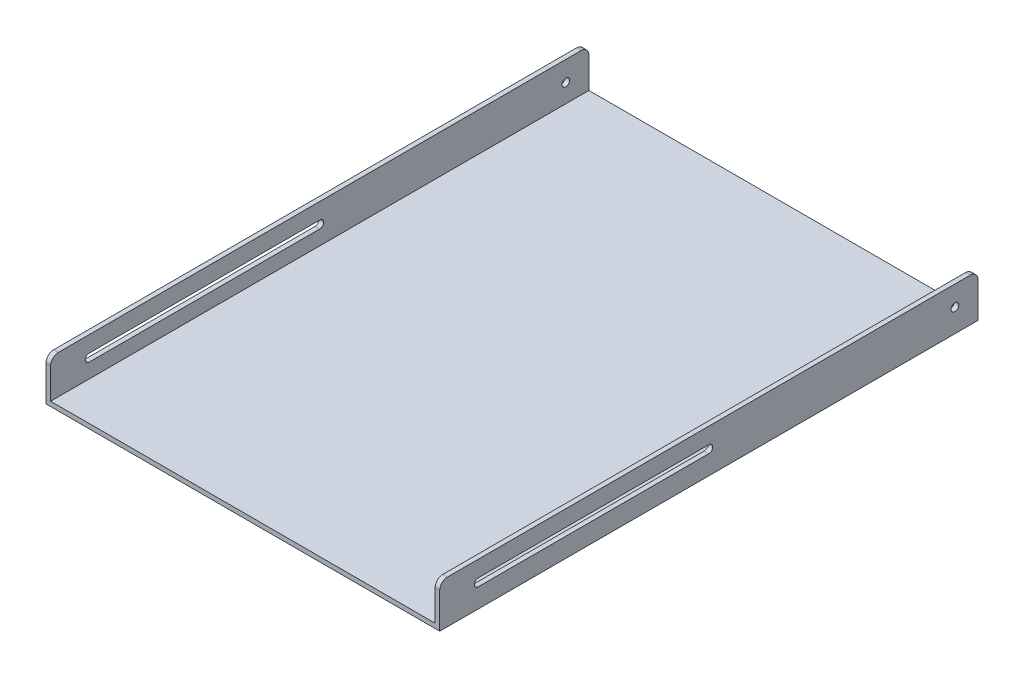
ISO-10303-21;
HEADER;
FILE_DESCRIPTION(('STEP AP214'),'2;1');
FILE_NAME('part.step','',(''),(''),'','','');
FILE_SCHEMA(('AUTOMOTIVE_DESIGN { 1 0 10303 214 1 1 1 1 }'));
ENDSEC;
DATA;
#1=APPLICATION_CONTEXT('core data for automotive mechanical design processes');
#2=APPLICATION_PROTOCOL_DEFINITION('international standard','automotive_design',2000,#1);
#3=PRODUCT_CONTEXT('',#1,'mechanical');
#4=PRODUCT('Part','Part','',(#3));
#5=PRODUCT_RELATED_PRODUCT_CATEGORY('part','',(#4));
#6=PRODUCT_DEFINITION_FORMATION('','',#4);
#7=PRODUCT_DEFINITION_CONTEXT('part definition',#1,'design');
#8=PRODUCT_DEFINITION('design','',#6,#7);
#9=PRODUCT_DEFINITION_SHAPE('','',#8);
#10=(LENGTH_UNIT() NAMED_UNIT(*) SI_UNIT(.MILLI.,.METRE.));
#11=(NAMED_UNIT(*) PLANE_ANGLE_UNIT() SI_UNIT($,.RADIAN.));
#12=(NAMED_UNIT(*) SI_UNIT($,.STERADIAN.) SOLID_ANGLE_UNIT());
#13=UNCERTAINTY_MEASURE_WITH_UNIT(LENGTH_MEASURE(1.E-05),#10,'distance_accuracy_value','');
#14=(GEOMETRIC_REPRESENTATION_CONTEXT(3) GLOBAL_UNCERTAINTY_ASSIGNED_CONTEXT((#13)) GLOBAL_UNIT_ASSIGNED_CONTEXT((#10,
#11,#12)) REPRESENTATION_CONTEXT('',''));
#15=CARTESIAN_POINT('',(0.,0.,0.));
#16=DIRECTION('',(0.,0.,1.));
#17=DIRECTION('',(1.,0.,0.));
#18=AXIS2_PLACEMENT_3D('',#15,#16,#17);
#19=CARTESIAN_POINT('',(256.,0.,350.));
#20=DIRECTION('',(-1.,0.,0.));
#21=DIRECTION('',(0.,0.,1.));
#22=AXIS2_PLACEMENT_3D('',#19,#20,#21);
#23=PLANE('',#22);
#24=DIRECTION('',(0.,0.,-1.));
#25=VECTOR('',#24,1.);
#26=CARTESIAN_POINT('',(256.,19.,300.));
#27=LINE('',#26,#25);
#28=CARTESIAN_POINT('',(256.,19.,300.));
#29=VERTEX_POINT('',#28);
#30=CARTESIAN_POINT('',(256.,19.,0.));
#31=VERTEX_POINT('',#30);
#32=EDGE_CURVE('E209',#29,#31,#27,.T.);
#33=ORIENTED_EDGE('',*,*,#32,.F.);
#34=CARTESIAN_POINT('',(256.,24.,300.));
#35=DIRECTION('',(1.,0.,0.));
#36=DIRECTION('',(0.,0.,-1.));
#37=AXIS2_PLACEMENT_3D('',#34,#35,#36);
#38=CIRCLE('',#37,5.);
#39=CARTESIAN_POINT('',(256.,29.,300.));
#40=VERTEX_POINT('',#39);
#41=EDGE_CURVE('E207',#40,#29,#38,.T.);
#42=ORIENTED_EDGE('',*,*,#41,.F.);
#43=DIRECTION('',(0.,0.,1.));
#44=VECTOR('',#43,1.);
#45=CARTESIAN_POINT('',(256.,29.,300.));
#46=LINE('',#45,#44);
#47=CARTESIAN_POINT('',(256.,29.0000000000001,0.));
#48=VERTEX_POINT('',#47);
#49=EDGE_CURVE('E199',#48,#40,#46,.T.);
#50=ORIENTED_EDGE('',*,*,#49,.F.);
#51=CARTESIAN_POINT('',(256.,24.,0.));
#52=DIRECTION('',(1.,0.,0.));
#53=DIRECTION('',(0.,0.,-1.));
#54=AXIS2_PLACEMENT_3D('',#51,#52,#53);
#55=CIRCLE('',#54,5.);
#56=EDGE_CURVE('E202',#31,#48,#55,.T.);
#57=ORIENTED_EDGE('',*,*,#56,.F.);
#58=EDGE_LOOP('',(#33,#42,#50,#57));
#59=FACE_BOUND('',#58,.T.);
#60=CARTESIAN_POINT('',(256.,24.,-320.));
#61=DIRECTION('',(1.,0.,0.));
#62=DIRECTION('',(0.,0.,-1.));
#63=AXIS2_PLACEMENT_3D('',#60,#61,#62);
#64=CIRCLE('',#63,4.99999999999999);
#65=CARTESIAN_POINT('',(256.,24.,-325.));
#66=VERTEX_POINT('',#65);
#67=EDGE_CURVE('E238',#66,#66,#64,.T.);
#68=ORIENTED_EDGE('',*,*,#67,.F.);
#69=EDGE_LOOP('',(#68));
#70=FACE_BOUND('',#69,.T.);
#71=DIRECTION('',(0.,0.,-1.));
#72=VECTOR('',#71,1.);
#73=CARTESIAN_POINT('',(256.,50.,350.));
#74=LINE('',#73,#72);
#75=CARTESIAN_POINT('',(256.,50.,340.));
#76=VERTEX_POINT('',#75);
#77=CARTESIAN_POINT('',(256.,50.,-340.));
#78=VERTEX_POINT('',#77);
#79=EDGE_CURVE('E299',#76,#78,#74,.T.);
#80=ORIENTED_EDGE('',*,*,#79,.F.);
#81=CARTESIAN_POINT('',(256.,40.,340.));
#82=DIRECTION('',(-1.,0.,0.));
#83=DIRECTION('',(0.,0.,1.));
#84=AXIS2_PLACEMENT_3D('',#81,#82,#83);
#85=CIRCLE('',#84,10.);
#86=CARTESIAN_POINT('',(256.,40.,350.));
#87=VERTEX_POINT('',#86);
#88=EDGE_CURVE('E309',#76,#87,#85,.F.);
#89=ORIENTED_EDGE('',*,*,#88,.T.);
#90=DIRECTION('',(0.,1.,0.));
#91=VECTOR('',#90,1.);
#92=CARTESIAN_POINT('',(256.,0.,350.));
#93=LINE('',#92,#91);
#94=CARTESIAN_POINT('',(256.,-6.,350.));
#95=VERTEX_POINT('',#94);
#96=EDGE_CURVE('E251',#95,#87,#93,.T.);
#97=ORIENTED_EDGE('',*,*,#96,.F.);
#98=DIRECTION('',(0.,0.,-1.));
#99=VECTOR('',#98,1.);
#100=CARTESIAN_POINT('',(256.,-6.,350.));
#101=LINE('',#100,#99);
#102=CARTESIAN_POINT('',(256.,-6.,-350.));
#103=VERTEX_POINT('',#102);
#104=EDGE_CURVE('E267',#95,#103,#101,.T.);
#105=ORIENTED_EDGE('',*,*,#104,.T.);
#106=DIRECTION('',(0.,1.,0.));
#107=VECTOR('',#106,1.);
#108=CARTESIAN_POINT('',(256.,0.,-350.));
#109=LINE('',#108,#107);
#110=CARTESIAN_POINT('',(256.,40.,-350.));
#111=VERTEX_POINT('',#110);
#112=EDGE_CURVE('E250',#103,#111,#109,.T.);
#113=ORIENTED_EDGE('',*,*,#112,.T.);
#114=CARTESIAN_POINT('',(256.,40.,-340.));
#115=DIRECTION('',(-1.,0.,0.));
#116=DIRECTION('',(0.,0.,1.));
#117=AXIS2_PLACEMENT_3D('',#114,#115,#116);
#118=CIRCLE('',#117,10.);
#119=EDGE_CURVE('E307',#111,#78,#118,.F.);
#120=ORIENTED_EDGE('',*,*,#119,.T.);
#121=EDGE_LOOP('',(#80,#89,#97,#105,#113,#120));
#122=FACE_BOUND('',#121,.T.);
#123=ADVANCED_FACE('F33',(#59,#70,#122),#23,.F.);
#124=CARTESIAN_POINT('',(250.,50.,350.));
#125=DIRECTION('',(0.,1.,0.));
#126=DIRECTION('',(0.,0.,1.));
#127=AXIS2_PLACEMENT_3D('',#124,#125,#126);
#128=PLANE('',#127);
#129=DIRECTION('',(0.,0.,-1.));
#130=VECTOR('',#129,1.);
#131=CARTESIAN_POINT('',(250.,50.,350.));
#132=LINE('',#131,#130);
#133=CARTESIAN_POINT('',(250.,50.,340.));
#134=VERTEX_POINT('',#133);
#135=CARTESIAN_POINT('',(250.,50.,-340.));
#136=VERTEX_POINT('',#135);
#137=EDGE_CURVE('E296',#134,#136,#132,.T.);
#138=ORIENTED_EDGE('',*,*,#137,.F.);
#139=DIRECTION('',(1.,0.,0.));
#140=VECTOR('',#139,1.);
#141=CARTESIAN_POINT('',(256.,50.,340.));
#142=LINE('',#141,#140);
#143=EDGE_CURVE('E304',#134,#76,#142,.T.);
#144=ORIENTED_EDGE('',*,*,#143,.T.);
#145=ORIENTED_EDGE('',*,*,#79,.T.);
#146=DIRECTION('',(1.,0.,0.));
#147=VECTOR('',#146,1.);
#148=CARTESIAN_POINT('',(250.,50.,-340.));
#149=LINE('',#148,#147);
#150=EDGE_CURVE('E302',#78,#136,#149,.F.);
#151=ORIENTED_EDGE('',*,*,#150,.T.);
#152=EDGE_LOOP('',(#138,#144,#145,#151));
#153=FACE_BOUND('',#152,.T.);
#154=ADVANCED_FACE('F372',(#153),#128,.T.);
#155=CARTESIAN_POINT('',(250.,0.,350.));
#156=DIRECTION('',(-1.,0.,0.));
#157=DIRECTION('',(0.,0.,1.));
#158=AXIS2_PLACEMENT_3D('',#155,#156,#157);
#159=PLANE('',#158);
#160=CARTESIAN_POINT('',(250.,24.,300.));
#161=DIRECTION('',(-1.,0.,0.));
#162=DIRECTION('',(0.,0.,1.));
#163=AXIS2_PLACEMENT_3D('',#160,#161,#162);
#164=CIRCLE('',#163,5.);
#165=CARTESIAN_POINT('',(250.,19.,300.));
#166=VERTEX_POINT('',#165);
#167=CARTESIAN_POINT('',(250.,29.,300.));
#168=VERTEX_POINT('',#167);
#169=EDGE_CURVE('E236',#166,#168,#164,.T.);
#170=ORIENTED_EDGE('',*,*,#169,.F.);
#171=DIRECTION('',(0.,0.,1.));
#172=VECTOR('',#171,1.);
#173=CARTESIAN_POINT('',(250.,19.,350.));
#174=LINE('',#173,#172);
#175=CARTESIAN_POINT('',(250.,19.0000000000001,0.));
#176=VERTEX_POINT('',#175);
#177=EDGE_CURVE('E224',#176,#166,#174,.T.);
#178=ORIENTED_EDGE('',*,*,#177,.F.);
#179=CARTESIAN_POINT('',(250.,24.,0.));
#180=DIRECTION('',(-1.,0.,0.));
#181=DIRECTION('',(0.,0.,1.));
#182=AXIS2_PLACEMENT_3D('',#179,#180,#181);
#183=CIRCLE('',#182,5.);
#184=CARTESIAN_POINT('',(250.,29.0000000000001,0.));
#185=VERTEX_POINT('',#184);
#186=EDGE_CURVE('E228',#185,#176,#183,.T.);
#187=ORIENTED_EDGE('',*,*,#186,.F.);
#188=DIRECTION('',(0.,0.,-1.));
#189=VECTOR('',#188,1.);
#190=CARTESIAN_POINT('',(250.,29.,350.));
#191=LINE('',#190,#189);
#192=EDGE_CURVE('E233',#168,#185,#191,.T.);
#193=ORIENTED_EDGE('',*,*,#192,.F.);
#194=EDGE_LOOP('',(#170,#178,#187,#193));
#195=FACE_BOUND('',#194,.T.);
#196=CARTESIAN_POINT('',(250.,24.,-320.));
#197=DIRECTION('',(-1.,0.,0.));
#198=DIRECTION('',(0.,0.,1.));
#199=AXIS2_PLACEMENT_3D('',#196,#197,#198);
#200=CIRCLE('',#199,4.99999999999999);
#201=CARTESIAN_POINT('',(250.,24.,-315.));
#202=VERTEX_POINT('',#201);
#203=EDGE_CURVE('E247',#202,#202,#200,.T.);
#204=ORIENTED_EDGE('',*,*,#203,.F.);
#205=EDGE_LOOP('',(#204));
#206=FACE_BOUND('',#205,.T.);
#207=DIRECTION('',(0.,1.,0.));
#208=VECTOR('',#207,1.);
#209=CARTESIAN_POINT('',(250.,0.,350.));
#210=LINE('',#209,#208);
#211=CARTESIAN_POINT('',(250.,0.,350.));
#212=VERTEX_POINT('',#211);
#213=CARTESIAN_POINT('',(250.,40.,350.));
#214=VERTEX_POINT('',#213);
#215=EDGE_CURVE('E254',#212,#214,#210,.T.);
#216=ORIENTED_EDGE('',*,*,#215,.T.);
#217=CARTESIAN_POINT('',(250.,40.,340.));
#218=DIRECTION('',(-1.,0.,0.));
#219=DIRECTION('',(0.,0.,1.));
#220=AXIS2_PLACEMENT_3D('',#217,#218,#219);
#221=CIRCLE('',#220,10.);
#222=EDGE_CURVE('E317',#214,#134,#221,.T.);
#223=ORIENTED_EDGE('',*,*,#222,.T.);
#224=ORIENTED_EDGE('',*,*,#137,.T.);
#225=CARTESIAN_POINT('',(250.,40.,-340.));
#226=DIRECTION('',(-1.,0.,0.));
#227=DIRECTION('',(0.,0.,1.));
#228=AXIS2_PLACEMENT_3D('',#225,#226,#227);
#229=CIRCLE('',#228,10.);
#230=CARTESIAN_POINT('',(250.,40.,-350.));
#231=VERTEX_POINT('',#230);
#232=EDGE_CURVE('E315',#136,#231,#229,.T.);
#233=ORIENTED_EDGE('',*,*,#232,.T.);
#234=DIRECTION('',(0.,1.,0.));
#235=VECTOR('',#234,1.);
#236=CARTESIAN_POINT('',(250.,0.,-350.));
#237=LINE('',#236,#235);
#238=CARTESIAN_POINT('',(250.,0.,-350.));
#239=VERTEX_POINT('',#238);
#240=EDGE_CURVE('E270',#239,#231,#237,.T.);
#241=ORIENTED_EDGE('',*,*,#240,.F.);
#242=DIRECTION('',(0.,0.,-1.));
#243=VECTOR('',#242,1.);
#244=CARTESIAN_POINT('',(250.,0.,350.));
#245=LINE('',#244,#243);
#246=EDGE_CURVE('E294',#212,#239,#245,.T.);
#247=ORIENTED_EDGE('',*,*,#246,.F.);
#248=EDGE_LOOP('',(#216,#223,#224,#233,#241,#247));
#249=FACE_BOUND('',#248,.T.);
#250=ADVANCED_FACE('F368',(#195,#206,#249),#159,.T.);
#251=CARTESIAN_POINT('',(-250.,0.,350.));
#252=DIRECTION('',(0.,1.,0.));
#253=DIRECTION('',(0.,0.,1.));
#254=AXIS2_PLACEMENT_3D('',#251,#252,#253);
#255=PLANE('',#254);
#256=DIRECTION('',(1.,0.,0.));
#257=VECTOR('',#256,1.);
#258=CARTESIAN_POINT('',(-250.,0.,-350.));
#259=LINE('',#258,#257);
#260=CARTESIAN_POINT('',(-250.,0.,-350.));
#261=VERTEX_POINT('',#260);
#262=EDGE_CURVE('E273',#261,#239,#259,.T.);
#263=ORIENTED_EDGE('',*,*,#262,.F.);
#264=DIRECTION('',(0.,0.,-1.));
#265=VECTOR('',#264,1.);
#266=CARTESIAN_POINT('',(-250.,0.,350.));
#267=LINE('',#266,#265);
#268=CARTESIAN_POINT('',(-250.,0.,350.));
#269=VERTEX_POINT('',#268);
#270=EDGE_CURVE('E291',#269,#261,#267,.T.);
#271=ORIENTED_EDGE('',*,*,#270,.F.);
#272=DIRECTION('',(1.,0.,0.));
#273=VECTOR('',#272,1.);
#274=CARTESIAN_POINT('',(-250.,0.,350.));
#275=LINE('',#274,#273);
#276=EDGE_CURVE('E258',#269,#212,#275,.T.);
#277=ORIENTED_EDGE('',*,*,#276,.T.);
#278=ORIENTED_EDGE('',*,*,#246,.T.);
#279=EDGE_LOOP('',(#263,#271,#277,#278));
#280=FACE_BOUND('',#279,.T.);
#281=ADVANCED_FACE('F364',(#280),#255,.T.);
#282=CARTESIAN_POINT('',(-250.,50.,350.));
#283=DIRECTION('',(1.,0.,0.));
#284=DIRECTION('',(0.,0.,-1.));
#285=AXIS2_PLACEMENT_3D('',#282,#283,#284);
#286=PLANE('',#285);
#287=CARTESIAN_POINT('',(-250.,24.,300.));
#288=DIRECTION('',(1.,0.,0.));
#289=DIRECTION('',(0.,0.,-1.));
#290=AXIS2_PLACEMENT_3D('',#287,#288,#289);
#291=CIRCLE('',#290,5.);
#292=CARTESIAN_POINT('',(-250.,29.,300.));
#293=VERTEX_POINT('',#292);
#294=CARTESIAN_POINT('',(-250.,19.,300.));
#295=VERTEX_POINT('',#294);
#296=EDGE_CURVE('E179',#293,#295,#291,.T.);
#297=ORIENTED_EDGE('',*,*,#296,.F.);
#298=DIRECTION('',(0.,0.,1.));
#299=VECTOR('',#298,1.);
#300=CARTESIAN_POINT('',(-250.,29.,350.));
#301=LINE('',#300,#299);
#302=CARTESIAN_POINT('',(-250.,29.0000000000001,0.));
#303=VERTEX_POINT('',#302);
#304=EDGE_CURVE('E231',#303,#293,#301,.T.);
#305=ORIENTED_EDGE('',*,*,#304,.F.);
#306=CARTESIAN_POINT('',(-250.,24.,0.));
#307=DIRECTION('',(1.,0.,0.));
#308=DIRECTION('',(0.,0.,-1.));
#309=AXIS2_PLACEMENT_3D('',#306,#307,#308);
#310=CIRCLE('',#309,5.);
#311=CARTESIAN_POINT('',(-250.,19.,0.));
#312=VERTEX_POINT('',#311);
#313=EDGE_CURVE('E226',#312,#303,#310,.T.);
#314=ORIENTED_EDGE('',*,*,#313,.F.);
#315=DIRECTION('',(0.,0.,-1.));
#316=VECTOR('',#315,1.);
#317=CARTESIAN_POINT('',(-250.,19.,350.));
#318=LINE('',#317,#316);
#319=EDGE_CURVE('E216',#295,#312,#318,.T.);
#320=ORIENTED_EDGE('',*,*,#319,.F.);
#321=EDGE_LOOP('',(#297,#305,#314,#320));
#322=FACE_BOUND('',#321,.T.);
#323=CARTESIAN_POINT('',(-250.,24.,-320.));
#324=DIRECTION('',(1.,0.,0.));
#325=DIRECTION('',(0.,0.,-1.));
#326=AXIS2_PLACEMENT_3D('',#323,#324,#325);
#327=CIRCLE('',#326,4.99999999999999);
#328=CARTESIAN_POINT('',(-250.,24.,-325.));
#329=VERTEX_POINT('',#328);
#330=EDGE_CURVE('E242',#329,#329,#327,.T.);
#331=ORIENTED_EDGE('',*,*,#330,.F.);
#332=EDGE_LOOP('',(#331));
#333=FACE_BOUND('',#332,.T.);
#334=DIRECTION('',(0.,0.,-1.));
#335=VECTOR('',#334,1.);
#336=CARTESIAN_POINT('',(-250.,50.,350.));
#337=LINE('',#336,#335);
#338=CARTESIAN_POINT('',(-250.,50.,340.));
#339=VERTEX_POINT('',#338);
#340=CARTESIAN_POINT('',(-250.,50.,-340.));
#341=VERTEX_POINT('',#340);
#342=EDGE_CURVE('E288',#339,#341,#337,.T.);
#343=ORIENTED_EDGE('',*,*,#342,.F.);
#344=CARTESIAN_POINT('',(-250.,40.,340.));
#345=DIRECTION('',(1.,0.,0.));
#346=DIRECTION('',(0.,0.,-1.));
#347=AXIS2_PLACEMENT_3D('',#344,#345,#346);
#348=CIRCLE('',#347,10.);
#349=CARTESIAN_POINT('',(-250.,40.,350.));
#350=VERTEX_POINT('',#349);
#351=EDGE_CURVE('E325',#339,#350,#348,.T.);
#352=ORIENTED_EDGE('',*,*,#351,.T.);
#353=DIRECTION('',(0.,-1.,0.));
#354=VECTOR('',#353,1.);
#355=CARTESIAN_POINT('',(-250.,50.,350.));
#356=LINE('',#355,#354);
#357=EDGE_CURVE('E261',#350,#269,#356,.T.);
#358=ORIENTED_EDGE('',*,*,#357,.T.);
#359=ORIENTED_EDGE('',*,*,#270,.T.);
#360=DIRECTION('',(0.,-1.,0.));
#361=VECTOR('',#360,1.);
#362=CARTESIAN_POINT('',(-250.,50.,-350.));
#363=LINE('',#362,#361);
#364=CARTESIAN_POINT('',(-250.,40.,-350.));
#365=VERTEX_POINT('',#364);
#366=EDGE_CURVE('E276',#365,#261,#363,.T.);
#367=ORIENTED_EDGE('',*,*,#366,.F.);
#368=CARTESIAN_POINT('',(-250.,40.,-340.));
#369=DIRECTION('',(1.,0.,0.));
#370=DIRECTION('',(0.,0.,-1.));
#371=AXIS2_PLACEMENT_3D('',#368,#369,#370);
#372=CIRCLE('',#371,10.);
#373=EDGE_CURVE('E56',#365,#341,#372,.T.);
#374=ORIENTED_EDGE('',*,*,#373,.T.);
#375=EDGE_LOOP('',(#343,#352,#358,#359,#367,#374));
#376=FACE_BOUND('',#375,.T.);
#377=ADVANCED_FACE('F359',(#322,#333,#376),#286,.T.);
#378=CARTESIAN_POINT('',(-256.,50.,350.));
#379=DIRECTION('',(0.,1.,0.));
#380=DIRECTION('',(0.,0.,1.));
#381=AXIS2_PLACEMENT_3D('',#378,#379,#380);
#382=PLANE('',#381);
#383=DIRECTION('',(0.,0.,-1.));
#384=VECTOR('',#383,1.);
#385=CARTESIAN_POINT('',(-256.,50.,350.));
#386=LINE('',#385,#384);
#387=CARTESIAN_POINT('',(-256.,50.,340.));
#388=VERTEX_POINT('',#387);
#389=CARTESIAN_POINT('',(-256.,50.,-340.));
#390=VERTEX_POINT('',#389);
#391=EDGE_CURVE('E286',#388,#390,#386,.T.);
#392=ORIENTED_EDGE('',*,*,#391,.F.);
#393=DIRECTION('',(1.,0.,0.));
#394=VECTOR('',#393,1.);
#395=CARTESIAN_POINT('',(-250.,50.,340.));
#396=LINE('',#395,#394);
#397=EDGE_CURVE('E321',#388,#339,#396,.T.);
#398=ORIENTED_EDGE('',*,*,#397,.T.);
#399=ORIENTED_EDGE('',*,*,#342,.T.);
#400=DIRECTION('',(1.,0.,0.));
#401=VECTOR('',#400,1.);
#402=CARTESIAN_POINT('',(-256.,50.,-340.));
#403=LINE('',#402,#401);
#404=EDGE_CURVE('E319',#341,#390,#403,.F.);
#405=ORIENTED_EDGE('',*,*,#404,.T.);
#406=EDGE_LOOP('',(#392,#398,#399,#405));
#407=FACE_BOUND('',#406,.T.);
#408=ADVANCED_FACE('F350',(#407),#382,.T.);
#409=CARTESIAN_POINT('',(-256.,50.,350.));
#410=DIRECTION('',(1.,0.,0.));
#411=DIRECTION('',(0.,0.,-1.));
#412=AXIS2_PLACEMENT_3D('',#409,#410,#411);
#413=PLANE('',#412);
#414=DIRECTION('',(0.,0.,1.));
#415=VECTOR('',#414,1.);
#416=CARTESIAN_POINT('',(-256.,29.,300.));
#417=LINE('',#416,#415);
#418=CARTESIAN_POINT('',(-256.,29.0000000000001,0.));
#419=VERTEX_POINT('',#418);
#420=CARTESIAN_POINT('',(-256.,29.,300.));
#421=VERTEX_POINT('',#420);
#422=EDGE_CURVE('E198',#419,#421,#417,.T.);
#423=ORIENTED_EDGE('',*,*,#422,.T.);
#424=CARTESIAN_POINT('',(-256.,24.,300.));
#425=DIRECTION('',(1.,0.,0.));
#426=DIRECTION('',(0.,0.,-1.));
#427=AXIS2_PLACEMENT_3D('',#424,#425,#426);
#428=CIRCLE('',#427,5.);
#429=CARTESIAN_POINT('',(-256.,19.,300.));
#430=VERTEX_POINT('',#429);
#431=EDGE_CURVE('E176',#421,#430,#428,.T.);
#432=ORIENTED_EDGE('',*,*,#431,.T.);
#433=DIRECTION('',(0.,0.,-1.));
#434=VECTOR('',#433,1.);
#435=CARTESIAN_POINT('',(-256.,19.,300.));
#436=LINE('',#435,#434);
#437=CARTESIAN_POINT('',(-256.,19.0000000000001,0.));
#438=VERTEX_POINT('',#437);
#439=EDGE_CURVE('E187',#430,#438,#436,.T.);
#440=ORIENTED_EDGE('',*,*,#439,.T.);
#441=CARTESIAN_POINT('',(-256.,24.,0.));
#442=DIRECTION('',(1.,0.,0.));
#443=DIRECTION('',(0.,0.,-1.));
#444=AXIS2_PLACEMENT_3D('',#441,#442,#443);
#445=CIRCLE('',#444,5.);
#446=EDGE_CURVE('E193',#438,#419,#445,.T.);
#447=ORIENTED_EDGE('',*,*,#446,.T.);
#448=EDGE_LOOP('',(#423,#432,#440,#447));
#449=FACE_BOUND('',#448,.T.);
#450=CARTESIAN_POINT('',(-256.,24.,-320.));
#451=DIRECTION('',(1.,0.,0.));
#452=DIRECTION('',(0.,0.,-1.));
#453=AXIS2_PLACEMENT_3D('',#450,#451,#452);
#454=CIRCLE('',#453,4.99999999999999);
#455=CARTESIAN_POINT('',(-256.,24.,-325.));
#456=VERTEX_POINT('',#455);
#457=EDGE_CURVE('E239',#456,#456,#454,.T.);
#458=ORIENTED_EDGE('',*,*,#457,.T.);
#459=EDGE_LOOP('',(#458));
#460=FACE_BOUND('',#459,.T.);
#461=DIRECTION('',(0.,1.,0.));
#462=VECTOR('',#461,1.);
#463=CARTESIAN_POINT('',(-256.,50.,350.));
#464=LINE('',#463,#462);
#465=CARTESIAN_POINT('',(-256.,40.,350.));
#466=VERTEX_POINT('',#465);
#467=CARTESIAN_POINT('',(-256.,-6.,350.));
#468=VERTEX_POINT('',#467);
#469=EDGE_CURVE('E263',#466,#468,#464,.F.);
#470=ORIENTED_EDGE('',*,*,#469,.F.);
#471=CARTESIAN_POINT('',(-256.,40.,340.));
#472=DIRECTION('',(1.,0.,0.));
#473=DIRECTION('',(0.,0.,-1.));
#474=AXIS2_PLACEMENT_3D('',#471,#472,#473);
#475=CIRCLE('',#474,10.);
#476=EDGE_CURVE('E328',#466,#388,#475,.F.);
#477=ORIENTED_EDGE('',*,*,#476,.T.);
#478=ORIENTED_EDGE('',*,*,#391,.T.);
#479=CARTESIAN_POINT('',(-256.,40.,-340.));
#480=DIRECTION('',(1.,0.,0.));
#481=DIRECTION('',(0.,0.,-1.));
#482=AXIS2_PLACEMENT_3D('',#479,#480,#481);
#483=CIRCLE('',#482,10.);
#484=CARTESIAN_POINT('',(-256.,40.,-350.));
#485=VERTEX_POINT('',#484);
#486=EDGE_CURVE('E48',#390,#485,#483,.F.);
#487=ORIENTED_EDGE('',*,*,#486,.T.);
#488=DIRECTION('',(0.,1.,0.));
#489=VECTOR('',#488,1.);
#490=CARTESIAN_POINT('',(-256.,50.,-350.));
#491=LINE('',#490,#489);
#492=CARTESIAN_POINT('',(-256.,-6.,-350.));
#493=VERTEX_POINT('',#492);
#494=EDGE_CURVE('E278',#485,#493,#491,.F.);
#495=ORIENTED_EDGE('',*,*,#494,.T.);
#496=DIRECTION('',(0.,0.,-1.));
#497=VECTOR('',#496,1.);
#498=CARTESIAN_POINT('',(-256.,-6.,350.));
#499=LINE('',#498,#497);
#500=EDGE_CURVE('E283',#468,#493,#499,.T.);
#501=ORIENTED_EDGE('',*,*,#500,.F.);
#502=EDGE_LOOP('',(#470,#477,#478,#487,#495,#501));
#503=FACE_BOUND('',#502,.T.);
#504=ADVANCED_FACE('F195',(#449,#460,#503),#413,.F.);
#505=CARTESIAN_POINT('',(-250.,-6.,350.));
#506=DIRECTION('',(0.,1.,0.));
#507=DIRECTION('',(0.,0.,1.));
#508=AXIS2_PLACEMENT_3D('',#505,#506,#507);
#509=PLANE('',#508);
#510=DIRECTION('',(1.,0.,0.));
#511=VECTOR('',#510,1.);
#512=CARTESIAN_POINT('',(-250.,-6.,-350.));
#513=LINE('',#512,#511);
#514=EDGE_CURVE('E255',#493,#103,#513,.T.);
#515=ORIENTED_EDGE('',*,*,#514,.T.);
#516=ORIENTED_EDGE('',*,*,#104,.F.);
#517=DIRECTION('',(1.,0.,0.));
#518=VECTOR('',#517,1.);
#519=CARTESIAN_POINT('',(-250.,-6.,350.));
#520=LINE('',#519,#518);
#521=EDGE_CURVE('E265',#468,#95,#520,.T.);
#522=ORIENTED_EDGE('',*,*,#521,.F.);
#523=ORIENTED_EDGE('',*,*,#500,.T.);
#524=EDGE_LOOP('',(#515,#516,#522,#523));
#525=FACE_BOUND('',#524,.T.);
#526=ADVANCED_FACE('F344',(#525),#509,.F.);
#527=CARTESIAN_POINT('',(0.,0.,350.));
#528=DIRECTION('',(0.,0.,-1.));
#529=DIRECTION('',(-1.,0.,0.));
#530=AXIS2_PLACEMENT_3D('',#527,#528,#529);
#531=PLANE('',#530);
#532=ORIENTED_EDGE('',*,*,#96,.T.);
#533=DIRECTION('',(1.,0.,0.));
#534=VECTOR('',#533,1.);
#535=CARTESIAN_POINT('',(250.,40.,350.));
#536=LINE('',#535,#534);
#537=EDGE_CURVE('E313',#87,#214,#536,.F.);
#538=ORIENTED_EDGE('',*,*,#537,.T.);
#539=ORIENTED_EDGE('',*,*,#215,.F.);
#540=ORIENTED_EDGE('',*,*,#276,.F.);
#541=ORIENTED_EDGE('',*,*,#357,.F.);
#542=DIRECTION('',(1.,0.,0.));
#543=VECTOR('',#542,1.);
#544=CARTESIAN_POINT('',(-256.,40.,350.));
#545=LINE('',#544,#543);
#546=EDGE_CURVE('E311',#350,#466,#545,.F.);
#547=ORIENTED_EDGE('',*,*,#546,.T.);
#548=ORIENTED_EDGE('',*,*,#469,.T.);
#549=ORIENTED_EDGE('',*,*,#521,.T.);
#550=EDGE_LOOP('',(#532,#538,#539,#540,#541,#547,#548,#549));
#551=FACE_BOUND('',#550,.T.);
#552=ADVANCED_FACE('F377',(#551),#531,.F.);
#553=CARTESIAN_POINT('',(0.,0.,-350.));
#554=DIRECTION('',(0.,0.,-1.));
#555=DIRECTION('',(-1.,0.,0.));
#556=AXIS2_PLACEMENT_3D('',#553,#554,#555);
#557=PLANE('',#556);
#558=ORIENTED_EDGE('',*,*,#494,.F.);
#559=DIRECTION('',(1.,0.,0.));
#560=VECTOR('',#559,1.);
#561=CARTESIAN_POINT('',(0.,40.,-350.));
#562=LINE('',#561,#560);
#563=EDGE_CURVE('E11',#485,#365,#562,.T.);
#564=ORIENTED_EDGE('',*,*,#563,.T.);
#565=ORIENTED_EDGE('',*,*,#366,.T.);
#566=ORIENTED_EDGE('',*,*,#262,.T.);
#567=ORIENTED_EDGE('',*,*,#240,.T.);
#568=DIRECTION('',(1.,0.,0.));
#569=VECTOR('',#568,1.);
#570=CARTESIAN_POINT('',(0.,40.,-350.));
#571=LINE('',#570,#569);
#572=EDGE_CURVE('E41',#231,#111,#571,.T.);
#573=ORIENTED_EDGE('',*,*,#572,.T.);
#574=ORIENTED_EDGE('',*,*,#112,.F.);
#575=ORIENTED_EDGE('',*,*,#514,.F.);
#576=EDGE_LOOP('',(#558,#564,#565,#566,#567,#573,#574,#575));
#577=FACE_BOUND('',#576,.T.);
#578=ADVANCED_FACE('F333',(#577),#557,.T.);
#579=CARTESIAN_POINT('',(-256.,24.,-320.));
#580=DIRECTION('',(1.,0.,0.));
#581=DIRECTION('',(0.,0.,-1.));
#582=AXIS2_PLACEMENT_3D('',#579,#580,#581);
#583=CYLINDRICAL_SURFACE('',#582,4.99999999999999);
#584=ORIENTED_EDGE('',*,*,#330,.T.);
#585=EDGE_LOOP('',(#584));
#586=FACE_BOUND('',#585,.T.);
#587=ORIENTED_EDGE('',*,*,#457,.F.);
#588=EDGE_LOOP('',(#587));
#589=FACE_BOUND('',#588,.T.);
#590=ADVANCED_FACE('F417',(#586,#589),#583,.F.);
#591=ORIENTED_EDGE('',*,*,#203,.T.);
#592=EDGE_LOOP('',(#591));
#593=FACE_BOUND('',#592,.T.);
#594=ORIENTED_EDGE('',*,*,#67,.T.);
#595=EDGE_LOOP('',(#594));
#596=FACE_BOUND('',#595,.T.);
#597=ADVANCED_FACE('F422',(#593,#596),#583,.F.);
#598=CARTESIAN_POINT('',(-256.,19.,300.));
#599=DIRECTION('',(0.,-1.,0.));
#600=DIRECTION('',(0.,0.,-1.));
#601=AXIS2_PLACEMENT_3D('',#598,#599,#600);
#602=PLANE('',#601);
#603=ORIENTED_EDGE('',*,*,#319,.T.);
#604=DIRECTION('',(1.,0.,0.));
#605=VECTOR('',#604,1.);
#606=CARTESIAN_POINT('',(-256.,19.,0.));
#607=LINE('',#606,#605);
#608=EDGE_CURVE('E190',#438,#312,#607,.T.);
#609=ORIENTED_EDGE('',*,*,#608,.F.);
#610=ORIENTED_EDGE('',*,*,#439,.F.);
#611=DIRECTION('',(1.,0.,0.));
#612=VECTOR('',#611,1.);
#613=CARTESIAN_POINT('',(-256.,19.,300.));
#614=LINE('',#613,#612);
#615=EDGE_CURVE('E171',#430,#295,#614,.T.);
#616=ORIENTED_EDGE('',*,*,#615,.T.);
#617=EDGE_LOOP('',(#603,#609,#610,#616));
#618=FACE_BOUND('',#617,.T.);
#619=ADVANCED_FACE('F188',(#618),#602,.F.);
#620=CARTESIAN_POINT('',(-256.,24.,0.));
#621=DIRECTION('',(1.,0.,0.));
#622=DIRECTION('',(0.,0.,-1.));
#623=AXIS2_PLACEMENT_3D('',#620,#621,#622);
#624=CYLINDRICAL_SURFACE('',#623,5.);
#625=ORIENTED_EDGE('',*,*,#313,.T.);
#626=DIRECTION('',(1.,0.,0.));
#627=VECTOR('',#626,1.);
#628=CARTESIAN_POINT('',(-256.,29.0000000000001,0.));
#629=LINE('',#628,#627);
#630=EDGE_CURVE('E218',#419,#303,#629,.T.);
#631=ORIENTED_EDGE('',*,*,#630,.F.);
#632=ORIENTED_EDGE('',*,*,#446,.F.);
#633=ORIENTED_EDGE('',*,*,#608,.T.);
#634=EDGE_LOOP('',(#625,#631,#632,#633));
#635=FACE_BOUND('',#634,.T.);
#636=ADVANCED_FACE('F429',(#635),#624,.F.);
#637=CARTESIAN_POINT('',(-256.,29.,300.));
#638=DIRECTION('',(0.,1.,0.));
#639=DIRECTION('',(0.,0.,1.));
#640=AXIS2_PLACEMENT_3D('',#637,#638,#639);
#641=PLANE('',#640);
#642=ORIENTED_EDGE('',*,*,#304,.T.);
#643=DIRECTION('',(1.,0.,0.));
#644=VECTOR('',#643,1.);
#645=CARTESIAN_POINT('',(-256.,29.,300.));
#646=LINE('',#645,#644);
#647=EDGE_CURVE('E214',#421,#293,#646,.T.);
#648=ORIENTED_EDGE('',*,*,#647,.F.);
#649=ORIENTED_EDGE('',*,*,#422,.F.);
#650=ORIENTED_EDGE('',*,*,#630,.T.);
#651=EDGE_LOOP('',(#642,#648,#649,#650));
#652=FACE_BOUND('',#651,.T.);
#653=ADVANCED_FACE('F426',(#652),#641,.F.);
#654=CARTESIAN_POINT('',(-256.,24.,300.));
#655=DIRECTION('',(1.,0.,0.));
#656=DIRECTION('',(0.,0.,-1.));
#657=AXIS2_PLACEMENT_3D('',#654,#655,#656);
#658=CYLINDRICAL_SURFACE('',#657,5.);
#659=ORIENTED_EDGE('',*,*,#296,.T.);
#660=ORIENTED_EDGE('',*,*,#615,.F.);
#661=ORIENTED_EDGE('',*,*,#431,.F.);
#662=ORIENTED_EDGE('',*,*,#647,.T.);
#663=EDGE_LOOP('',(#659,#660,#661,#662));
#664=FACE_BOUND('',#663,.T.);
#665=ADVANCED_FACE('F173',(#664),#658,.F.);
#666=ORIENTED_EDGE('',*,*,#169,.T.);
#667=EDGE_CURVE('E217',#168,#40,#646,.T.);
#668=ORIENTED_EDGE('',*,*,#667,.T.);
#669=ORIENTED_EDGE('',*,*,#41,.T.);
#670=EDGE_CURVE('E183',#166,#29,#614,.T.);
#671=ORIENTED_EDGE('',*,*,#670,.F.);
#672=EDGE_LOOP('',(#666,#668,#669,#671));
#673=FACE_BOUND('',#672,.T.);
#674=ADVANCED_FACE('F425',(#673),#658,.F.);
#675=ORIENTED_EDGE('',*,*,#192,.T.);
#676=EDGE_CURVE('E221',#185,#48,#629,.T.);
#677=ORIENTED_EDGE('',*,*,#676,.T.);
#678=ORIENTED_EDGE('',*,*,#49,.T.);
#679=ORIENTED_EDGE('',*,*,#667,.F.);
#680=EDGE_LOOP('',(#675,#677,#678,#679));
#681=FACE_BOUND('',#680,.T.);
#682=ADVANCED_FACE('F435',(#681),#641,.F.);
#683=ORIENTED_EDGE('',*,*,#186,.T.);
#684=EDGE_CURVE('E182',#176,#31,#607,.T.);
#685=ORIENTED_EDGE('',*,*,#684,.T.);
#686=ORIENTED_EDGE('',*,*,#56,.T.);
#687=ORIENTED_EDGE('',*,*,#676,.F.);
#688=EDGE_LOOP('',(#683,#685,#686,#687));
#689=FACE_BOUND('',#688,.T.);
#690=ADVANCED_FACE('F388',(#689),#624,.F.);
#691=ORIENTED_EDGE('',*,*,#177,.T.);
#692=ORIENTED_EDGE('',*,*,#670,.T.);
#693=ORIENTED_EDGE('',*,*,#32,.T.);
#694=ORIENTED_EDGE('',*,*,#684,.F.);
#695=EDGE_LOOP('',(#691,#692,#693,#694));
#696=FACE_BOUND('',#695,.T.);
#697=ADVANCED_FACE('F381',(#696),#602,.F.);
#698=CARTESIAN_POINT('',(250.,40.,340.));
#699=DIRECTION('',(-1.,0.,0.));
#700=DIRECTION('',(0.,0.,1.));
#701=AXIS2_PLACEMENT_3D('',#698,#699,#700);
#702=CYLINDRICAL_SURFACE('',#701,10.);
#703=ORIENTED_EDGE('',*,*,#222,.F.);
#704=ORIENTED_EDGE('',*,*,#537,.F.);
#705=ORIENTED_EDGE('',*,*,#88,.F.);
#706=ORIENTED_EDGE('',*,*,#143,.F.);
#707=EDGE_LOOP('',(#703,#704,#705,#706));
#708=FACE_BOUND('',#707,.T.);
#709=ADVANCED_FACE('F379',(#708),#702,.T.);
#710=CARTESIAN_POINT('',(-256.,40.,340.));
#711=DIRECTION('',(-1.,0.,0.));
#712=DIRECTION('',(0.,0.,1.));
#713=AXIS2_PLACEMENT_3D('',#710,#711,#712);
#714=CYLINDRICAL_SURFACE('',#713,10.);
#715=ORIENTED_EDGE('',*,*,#476,.F.);
#716=ORIENTED_EDGE('',*,*,#546,.F.);
#717=ORIENTED_EDGE('',*,*,#351,.F.);
#718=ORIENTED_EDGE('',*,*,#397,.F.);
#719=EDGE_LOOP('',(#715,#716,#717,#718));
#720=FACE_BOUND('',#719,.T.);
#721=ADVANCED_FACE('F357',(#720),#714,.T.);
#722=CARTESIAN_POINT('',(0.,40.,-340.));
#723=DIRECTION('',(1.,0.,0.));
#724=DIRECTION('',(0.,0.,-1.));
#725=AXIS2_PLACEMENT_3D('',#722,#723,#724);
#726=CYLINDRICAL_SURFACE('',#725,10.);
#727=ORIENTED_EDGE('',*,*,#486,.F.);
#728=ORIENTED_EDGE('',*,*,#404,.F.);
#729=ORIENTED_EDGE('',*,*,#373,.F.);
#730=ORIENTED_EDGE('',*,*,#563,.F.);
#731=EDGE_LOOP('',(#727,#728,#729,#730));
#732=FACE_BOUND('',#731,.T.);
#733=ADVANCED_FACE('F347',(#732),#726,.T.);
#734=CARTESIAN_POINT('',(0.,40.,-340.));
#735=DIRECTION('',(1.,0.,0.));
#736=DIRECTION('',(0.,0.,-1.));
#737=AXIS2_PLACEMENT_3D('',#734,#735,#736);
#738=CYLINDRICAL_SURFACE('',#737,10.);
#739=ORIENTED_EDGE('',*,*,#232,.F.);
#740=ORIENTED_EDGE('',*,*,#150,.F.);
#741=ORIENTED_EDGE('',*,*,#119,.F.);
#742=ORIENTED_EDGE('',*,*,#572,.F.);
#743=EDGE_LOOP('',(#739,#740,#741,#742));
#744=FACE_BOUND('',#743,.T.);
#745=ADVANCED_FACE('F35',(#744),#738,.T.);
#746=CLOSED_SHELL('',(#123,#154,#250,#281,#377,#408,#504,#526,#552,#578,#590,#597,#619,#636,
#653,#665,#674,#682,#690,#697,#709,#721,#733,#745));
#747=MANIFOLD_SOLID_BREP('B2',#746);
#748=ADVANCED_BREP_SHAPE_REPRESENTATION('',(#18,#747),#14);
#749=SHAPE_DEFINITION_REPRESENTATION(#9,#748);
ENDSEC;
END-ISO-10303-21;
